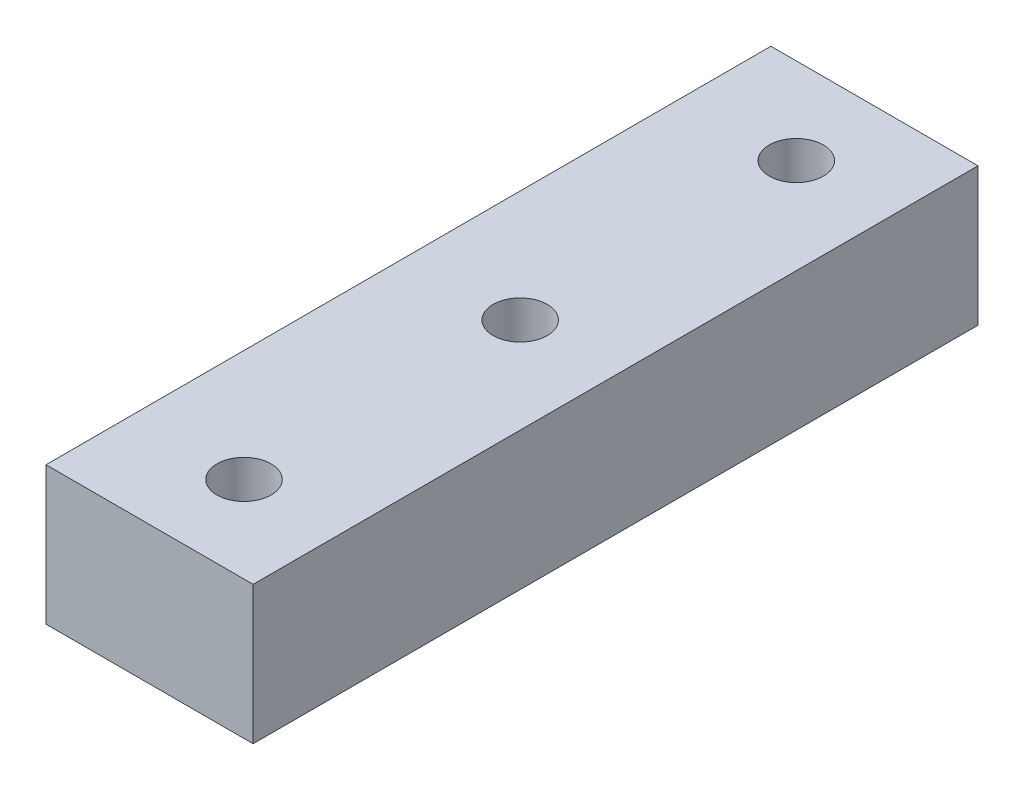
ISO-10303-21;
HEADER;
FILE_DESCRIPTION(('STEP AP214'),'2;1');
FILE_NAME('part.step','',(''),(''),'','','');
FILE_SCHEMA(('AUTOMOTIVE_DESIGN { 1 0 10303 214 1 1 1 1 }'));
ENDSEC;
DATA;
#1=APPLICATION_CONTEXT('core data for automotive mechanical design processes');
#2=APPLICATION_PROTOCOL_DEFINITION('international standard','automotive_design',2000,#1);
#3=PRODUCT_CONTEXT('',#1,'mechanical');
#4=PRODUCT('Part','Part','',(#3));
#5=PRODUCT_RELATED_PRODUCT_CATEGORY('part','',(#4));
#6=PRODUCT_DEFINITION_FORMATION('','',#4);
#7=PRODUCT_DEFINITION_CONTEXT('part definition',#1,'design');
#8=PRODUCT_DEFINITION('design','',#6,#7);
#9=PRODUCT_DEFINITION_SHAPE('','',#8);
#10=(LENGTH_UNIT() NAMED_UNIT(*) SI_UNIT(.MILLI.,.METRE.));
#11=(NAMED_UNIT(*) PLANE_ANGLE_UNIT() SI_UNIT($,.RADIAN.));
#12=(NAMED_UNIT(*) SI_UNIT($,.STERADIAN.) SOLID_ANGLE_UNIT());
#13=UNCERTAINTY_MEASURE_WITH_UNIT(LENGTH_MEASURE(1.E-05),#10,'distance_accuracy_value','');
#14=(GEOMETRIC_REPRESENTATION_CONTEXT(3) GLOBAL_UNCERTAINTY_ASSIGNED_CONTEXT((#13)) GLOBAL_UNIT_ASSIGNED_CONTEXT((#10,
#11,#12)) REPRESENTATION_CONTEXT('',''));
#15=CARTESIAN_POINT('',(0.,0.,0.));
#16=DIRECTION('',(0.,0.,1.));
#17=DIRECTION('',(1.,0.,0.));
#18=AXIS2_PLACEMENT_3D('',#15,#16,#17);
#19=CARTESIAN_POINT('',(-71.608792588351,12.7,38.2171018634932));
#20=DIRECTION('',(0.,0.,-1.));
#21=DIRECTION('',(-1.,0.,0.));
#22=AXIS2_PLACEMENT_3D('',#19,#20,#21);
#23=PLANE('',#22);
#24=DIRECTION('',(1.,0.,0.));
#25=VECTOR('',#24,1.);
#26=CARTESIAN_POINT('',(-71.608792588351,0.,38.2171018634932));
#27=LINE('',#26,#25);
#28=CARTESIAN_POINT('',(-71.608792588351,0.,38.2171018634932));
#29=VERTEX_POINT('',#28);
#30=CARTESIAN_POINT('',(-52.558792588351,0.,38.2171018634932));
#31=VERTEX_POINT('',#30);
#32=EDGE_CURVE('E99',#29,#31,#27,.T.);
#33=ORIENTED_EDGE('',*,*,#32,.T.);
#34=DIRECTION('',(0.,-1.,0.));
#35=VECTOR('',#34,1.);
#36=CARTESIAN_POINT('',(-52.558792588351,12.7,38.2171018634932));
#37=LINE('',#36,#35);
#38=CARTESIAN_POINT('',(-52.558792588351,12.7,38.2171018634932));
#39=VERTEX_POINT('',#38);
#40=EDGE_CURVE('E52',#39,#31,#37,.T.);
#41=ORIENTED_EDGE('',*,*,#40,.F.);
#42=DIRECTION('',(1.,0.,0.));
#43=VECTOR('',#42,1.);
#44=CARTESIAN_POINT('',(-71.608792588351,12.7,38.2171018634932));
#45=LINE('',#44,#43);
#46=CARTESIAN_POINT('',(-71.608792588351,12.7,38.2171018634932));
#47=VERTEX_POINT('',#46);
#48=EDGE_CURVE('E89',#47,#39,#45,.T.);
#49=ORIENTED_EDGE('',*,*,#48,.F.);
#50=DIRECTION('',(0.,-1.,0.));
#51=VECTOR('',#50,1.);
#52=CARTESIAN_POINT('',(-71.608792588351,12.7,38.2171018634932));
#53=LINE('',#52,#51);
#54=EDGE_CURVE('E11',#47,#29,#53,.T.);
#55=ORIENTED_EDGE('',*,*,#54,.T.);
#56=EDGE_LOOP('',(#33,#41,#49,#55));
#57=FACE_BOUND('',#56,.T.);
#58=ADVANCED_FACE('F43',(#57),#23,.F.);
#59=CARTESIAN_POINT('',(-52.558792588351,12.7,-28.4578981365068));
#60=DIRECTION('',(-1.,0.,0.));
#61=DIRECTION('',(0.,0.,1.));
#62=AXIS2_PLACEMENT_3D('',#59,#60,#61);
#63=PLANE('',#62);
#64=DIRECTION('',(0.,0.,-1.));
#65=VECTOR('',#64,1.);
#66=CARTESIAN_POINT('',(-52.558792588351,0.,-28.4578981365068));
#67=LINE('',#66,#65);
#68=CARTESIAN_POINT('',(-52.558792588351,0.,-28.4578981365068));
#69=VERTEX_POINT('',#68);
#70=EDGE_CURVE('E77',#31,#69,#67,.T.);
#71=ORIENTED_EDGE('',*,*,#70,.T.);
#72=DIRECTION('',(0.,-1.,0.));
#73=VECTOR('',#72,1.);
#74=CARTESIAN_POINT('',(-52.558792588351,12.7,-28.4578981365068));
#75=LINE('',#74,#73);
#76=CARTESIAN_POINT('',(-52.558792588351,12.7,-28.4578981365068));
#77=VERTEX_POINT('',#76);
#78=EDGE_CURVE('E101',#77,#69,#75,.T.);
#79=ORIENTED_EDGE('',*,*,#78,.F.);
#80=DIRECTION('',(0.,0.,-1.));
#81=VECTOR('',#80,1.);
#82=CARTESIAN_POINT('',(-52.558792588351,12.7,12.8171018634932));
#83=LINE('',#82,#81);
#84=EDGE_CURVE('E93',#39,#77,#83,.T.);
#85=ORIENTED_EDGE('',*,*,#84,.F.);
#86=ORIENTED_EDGE('',*,*,#40,.T.);
#87=EDGE_LOOP('',(#71,#79,#85,#86));
#88=FACE_BOUND('',#87,.T.);
#89=ADVANCED_FACE('F102',(#88),#63,.F.);
#90=CARTESIAN_POINT('',(-71.608792588351,12.7,-28.4578981365068));
#91=DIRECTION('',(0.,0.,1.));
#92=DIRECTION('',(1.,0.,0.));
#93=AXIS2_PLACEMENT_3D('',#90,#91,#92);
#94=PLANE('',#93);
#95=DIRECTION('',(-1.,0.,0.));
#96=VECTOR('',#95,1.);
#97=CARTESIAN_POINT('',(-71.608792588351,0.,-28.4578981365068));
#98=LINE('',#97,#96);
#99=CARTESIAN_POINT('',(-71.608792588351,0.,-28.4578981365068));
#100=VERTEX_POINT('',#99);
#101=EDGE_CURVE('E84',#69,#100,#98,.T.);
#102=ORIENTED_EDGE('',*,*,#101,.T.);
#103=DIRECTION('',(0.,-1.,0.));
#104=VECTOR('',#103,1.);
#105=CARTESIAN_POINT('',(-71.608792588351,12.7,-28.4578981365068));
#106=LINE('',#105,#104);
#107=CARTESIAN_POINT('',(-71.608792588351,12.7,-28.4578981365068));
#108=VERTEX_POINT('',#107);
#109=EDGE_CURVE('E108',#108,#100,#106,.T.);
#110=ORIENTED_EDGE('',*,*,#109,.F.);
#111=DIRECTION('',(-1.,0.,0.));
#112=VECTOR('',#111,1.);
#113=CARTESIAN_POINT('',(-71.608792588351,12.7,-28.4578981365068));
#114=LINE('',#113,#112);
#115=EDGE_CURVE('E105',#77,#108,#114,.T.);
#116=ORIENTED_EDGE('',*,*,#115,.F.);
#117=ORIENTED_EDGE('',*,*,#78,.T.);
#118=EDGE_LOOP('',(#102,#110,#116,#117));
#119=FACE_BOUND('',#118,.T.);
#120=ADVANCED_FACE('F125',(#119),#94,.F.);
#121=CARTESIAN_POINT('',(-71.608792588351,12.7,-6.23289813650677));
#122=DIRECTION('',(1.,0.,0.));
#123=DIRECTION('',(0.,0.,-1.));
#124=AXIS2_PLACEMENT_3D('',#121,#122,#123);
#125=PLANE('',#124);
#126=DIRECTION('',(0.,0.,1.));
#127=VECTOR('',#126,1.);
#128=CARTESIAN_POINT('',(-71.608792588351,0.,-6.23289813650677));
#129=LINE('',#128,#127);
#130=EDGE_CURVE('E119',#100,#29,#129,.T.);
#131=ORIENTED_EDGE('',*,*,#130,.T.);
#132=ORIENTED_EDGE('',*,*,#54,.F.);
#133=DIRECTION('',(0.,0.,1.));
#134=VECTOR('',#133,1.);
#135=CARTESIAN_POINT('',(-71.608792588351,12.7,12.8171018634932));
#136=LINE('',#135,#134);
#137=EDGE_CURVE('E60',#108,#47,#136,.T.);
#138=ORIENTED_EDGE('',*,*,#137,.F.);
#139=ORIENTED_EDGE('',*,*,#109,.T.);
#140=EDGE_LOOP('',(#131,#132,#138,#139));
#141=FACE_BOUND('',#140,.T.);
#142=ADVANCED_FACE('F129',(#141),#125,.F.);
#143=CARTESIAN_POINT('',(0.,12.7,0.));
#144=DIRECTION('',(0.,-1.,0.));
#145=DIRECTION('',(0.,0.,-1.));
#146=AXIS2_PLACEMENT_3D('',#143,#144,#145);
#147=PLANE('',#146);
#148=CARTESIAN_POINT('',(-61.333792588351,12.7,-20.5203981365068));
#149=DIRECTION('',(0.,1.,0.));
#150=DIRECTION('',(0.,0.,1.));
#151=AXIS2_PLACEMENT_3D('',#148,#149,#150);
#152=CIRCLE('',#151,2.48919999999999);
#153=CARTESIAN_POINT('',(-61.333792588351,12.7,-18.0311981365068));
#154=VERTEX_POINT('',#153);
#155=EDGE_CURVE('E241',#154,#154,#152,.T.);
#156=ORIENTED_EDGE('',*,*,#155,.F.);
#157=EDGE_LOOP('',(#156));
#158=FACE_BOUND('',#157,.T.);
#159=CARTESIAN_POINT('',(-61.333792588351,12.7,4.87960186349324));
#160=DIRECTION('',(0.,1.,0.));
#161=DIRECTION('',(0.,0.,1.));
#162=AXIS2_PLACEMENT_3D('',#159,#160,#161);
#163=CIRCLE('',#162,2.48919999999999);
#164=CARTESIAN_POINT('',(-61.333792588351,12.7,7.36880186349323));
#165=VERTEX_POINT('',#164);
#166=EDGE_CURVE('E245',#165,#165,#163,.T.);
#167=ORIENTED_EDGE('',*,*,#166,.F.);
#168=EDGE_LOOP('',(#167));
#169=FACE_BOUND('',#168,.T.);
#170=CARTESIAN_POINT('',(-61.333792588351,12.7,30.2796018634932));
#171=DIRECTION('',(0.,1.,0.));
#172=DIRECTION('',(0.,0.,1.));
#173=AXIS2_PLACEMENT_3D('',#170,#171,#172);
#174=CIRCLE('',#173,2.48919999999999);
#175=CARTESIAN_POINT('',(-61.333792588351,12.7,32.7688018634932));
#176=VERTEX_POINT('',#175);
#177=EDGE_CURVE('E255',#176,#176,#174,.T.);
#178=ORIENTED_EDGE('',*,*,#177,.F.);
#179=EDGE_LOOP('',(#178));
#180=FACE_BOUND('',#179,.T.);
#181=ORIENTED_EDGE('',*,*,#137,.T.);
#182=ORIENTED_EDGE('',*,*,#48,.T.);
#183=ORIENTED_EDGE('',*,*,#84,.T.);
#184=ORIENTED_EDGE('',*,*,#115,.T.);
#185=EDGE_LOOP('',(#181,#182,#183,#184));
#186=FACE_BOUND('',#185,.T.);
#187=ADVANCED_FACE('F91',(#158,#169,#180,#186),#147,.F.);
#188=CARTESIAN_POINT('',(0.,0.,0.));
#189=DIRECTION('',(0.,-1.,0.));
#190=DIRECTION('',(0.,0.,-1.));
#191=AXIS2_PLACEMENT_3D('',#188,#189,#190);
#192=PLANE('',#191);
#193=CARTESIAN_POINT('',(-61.333792588351,0.,-20.5203981365068));
#194=DIRECTION('',(0.,1.,0.));
#195=DIRECTION('',(0.,0.,1.));
#196=AXIS2_PLACEMENT_3D('',#193,#194,#195);
#197=CIRCLE('',#196,2.4892);
#198=CARTESIAN_POINT('',(-61.333792588351,0.,-18.0311981365068));
#199=VERTEX_POINT('',#198);
#200=EDGE_CURVE('E238',#199,#199,#197,.T.);
#201=ORIENTED_EDGE('',*,*,#200,.T.);
#202=EDGE_LOOP('',(#201));
#203=FACE_BOUND('',#202,.T.);
#204=CARTESIAN_POINT('',(-61.333792588351,0.,4.87960186349324));
#205=DIRECTION('',(0.,1.,0.));
#206=DIRECTION('',(0.,0.,1.));
#207=AXIS2_PLACEMENT_3D('',#204,#205,#206);
#208=CIRCLE('',#207,2.4892);
#209=CARTESIAN_POINT('',(-61.333792588351,0.,7.36880186349324));
#210=VERTEX_POINT('',#209);
#211=EDGE_CURVE('E251',#210,#210,#208,.T.);
#212=ORIENTED_EDGE('',*,*,#211,.T.);
#213=EDGE_LOOP('',(#212));
#214=FACE_BOUND('',#213,.T.);
#215=CARTESIAN_POINT('',(-61.333792588351,0.,30.2796018634932));
#216=DIRECTION('',(0.,1.,0.));
#217=DIRECTION('',(0.,0.,1.));
#218=AXIS2_PLACEMENT_3D('',#215,#216,#217);
#219=CIRCLE('',#218,2.4892);
#220=CARTESIAN_POINT('',(-61.333792588351,0.,32.7688018634932));
#221=VERTEX_POINT('',#220);
#222=EDGE_CURVE('E114',#221,#221,#219,.T.);
#223=ORIENTED_EDGE('',*,*,#222,.T.);
#224=EDGE_LOOP('',(#223));
#225=FACE_BOUND('',#224,.T.);
#226=ORIENTED_EDGE('',*,*,#32,.F.);
#227=ORIENTED_EDGE('',*,*,#130,.F.);
#228=ORIENTED_EDGE('',*,*,#101,.F.);
#229=ORIENTED_EDGE('',*,*,#70,.F.);
#230=EDGE_LOOP('',(#226,#227,#228,#229));
#231=FACE_BOUND('',#230,.T.);
#232=ADVANCED_FACE('F128',(#203,#214,#225,#231),#192,.T.);
#233=CARTESIAN_POINT('',(-61.333792588351,12.7,30.2796018634932));
#234=DIRECTION('',(0.,1.,0.));
#235=DIRECTION('',(0.,0.,1.));
#236=AXIS2_PLACEMENT_3D('',#233,#234,#235);
#237=CYLINDRICAL_SURFACE('',#236,2.48919999999999);
#238=ORIENTED_EDGE('',*,*,#222,.F.);
#239=EDGE_LOOP('',(#238));
#240=FACE_BOUND('',#239,.T.);
#241=ORIENTED_EDGE('',*,*,#177,.T.);
#242=EDGE_LOOP('',(#241));
#243=FACE_BOUND('',#242,.T.);
#244=ADVANCED_FACE('F173',(#240,#243),#237,.F.);
#245=CARTESIAN_POINT('',(-61.333792588351,12.7,4.87960186349324));
#246=DIRECTION('',(0.,1.,0.));
#247=DIRECTION('',(0.,0.,1.));
#248=AXIS2_PLACEMENT_3D('',#245,#246,#247);
#249=CYLINDRICAL_SURFACE('',#248,2.48919999999999);
#250=ORIENTED_EDGE('',*,*,#211,.F.);
#251=EDGE_LOOP('',(#250));
#252=FACE_BOUND('',#251,.T.);
#253=ORIENTED_EDGE('',*,*,#166,.T.);
#254=EDGE_LOOP('',(#253));
#255=FACE_BOUND('',#254,.T.);
#256=ADVANCED_FACE('F183',(#252,#255),#249,.F.);
#257=CARTESIAN_POINT('',(-61.333792588351,12.7,-20.5203981365068));
#258=DIRECTION('',(0.,1.,0.));
#259=DIRECTION('',(0.,0.,1.));
#260=AXIS2_PLACEMENT_3D('',#257,#258,#259);
#261=CYLINDRICAL_SURFACE('',#260,2.48919999999999);
#262=ORIENTED_EDGE('',*,*,#200,.F.);
#263=EDGE_LOOP('',(#262));
#264=FACE_BOUND('',#263,.T.);
#265=ORIENTED_EDGE('',*,*,#155,.T.);
#266=EDGE_LOOP('',(#265));
#267=FACE_BOUND('',#266,.T.);
#268=ADVANCED_FACE('F194',(#264,#267),#261,.F.);
#269=CLOSED_SHELL('',(#58,#89,#120,#142,#187,#232,#244,#256,#268));
#270=MANIFOLD_SOLID_BREP('B2',#269);
#271=ADVANCED_BREP_SHAPE_REPRESENTATION('',(#18,#270),#14);
#272=SHAPE_DEFINITION_REPRESENTATION(#9,#271);
ENDSEC;
END-ISO-10303-21;
